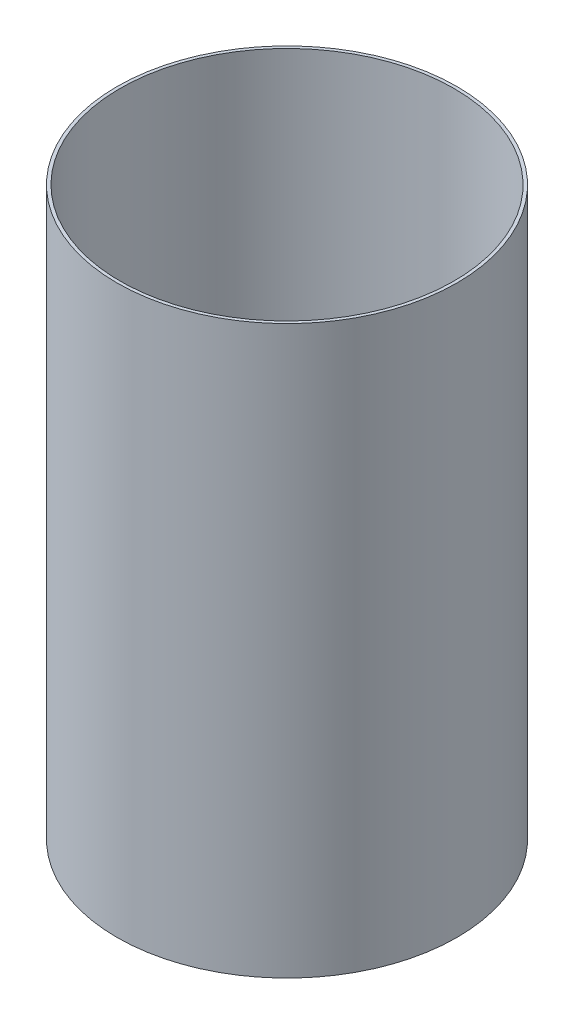
ISO-10303-21;
HEADER;
FILE_DESCRIPTION(('STEP AP214'),'2;1');
FILE_NAME('part.step','',(''),(''),'','','');
FILE_SCHEMA(('AUTOMOTIVE_DESIGN { 1 0 10303 214 1 1 1 1 }'));
ENDSEC;
DATA;
#1=APPLICATION_CONTEXT('core data for automotive mechanical design processes');
#2=APPLICATION_PROTOCOL_DEFINITION('international standard','automotive_design',2000,#1);
#3=PRODUCT_CONTEXT('',#1,'mechanical');
#4=PRODUCT('Part','Part','',(#3));
#5=PRODUCT_RELATED_PRODUCT_CATEGORY('part','',(#4));
#6=PRODUCT_DEFINITION_FORMATION('','',#4);
#7=PRODUCT_DEFINITION_CONTEXT('part definition',#1,'design');
#8=PRODUCT_DEFINITION('design','',#6,#7);
#9=PRODUCT_DEFINITION_SHAPE('','',#8);
#10=(LENGTH_UNIT() NAMED_UNIT(*) SI_UNIT(.MILLI.,.METRE.));
#11=(NAMED_UNIT(*) PLANE_ANGLE_UNIT() SI_UNIT($,.RADIAN.));
#12=(NAMED_UNIT(*) SI_UNIT($,.STERADIAN.) SOLID_ANGLE_UNIT());
#13=UNCERTAINTY_MEASURE_WITH_UNIT(LENGTH_MEASURE(1.E-05),#10,'distance_accuracy_value','');
#14=(GEOMETRIC_REPRESENTATION_CONTEXT(3) GLOBAL_UNCERTAINTY_ASSIGNED_CONTEXT((#13)) GLOBAL_UNIT_ASSIGNED_CONTEXT((#10,
#11,#12)) REPRESENTATION_CONTEXT('',''));
#15=CARTESIAN_POINT('',(0.,0.,0.));
#16=DIRECTION('',(0.,0.,1.));
#17=DIRECTION('',(1.,0.,0.));
#18=AXIS2_PLACEMENT_3D('',#15,#16,#17);
#19=CARTESIAN_POINT('',(0.,-59.999999882,0.));
#20=DIRECTION('',(0.,-1.,0.));
#21=DIRECTION('',(0.,0.,-1.));
#22=AXIS2_PLACEMENT_3D('',#19,#20,#21);
#23=CYLINDRICAL_SURFACE('',#22,67.7341988827448);
#24=CARTESIAN_POINT('',(0.,-59.999999882,0.));
#25=DIRECTION('',(0.,-1.,0.));
#26=DIRECTION('',(0.,0.,-1.));
#27=AXIS2_PLACEMENT_3D('',#24,#25,#26);
#28=CIRCLE('',#27,67.7341988827448);
#29=CARTESIAN_POINT('',(0.,-59.999999882,-67.7341988827448));
#30=VERTEX_POINT('',#29);
#31=EDGE_CURVE('E46',#30,#30,#28,.T.);
#32=ORIENTED_EDGE('',*,*,#31,.F.);
#33=EDGE_LOOP('',(#32));
#34=FACE_BOUND('',#33,.T.);
#35=CARTESIAN_POINT('',(0.,-289.999999882,0.));
#36=DIRECTION('',(0.,-1.,0.));
#37=DIRECTION('',(0.,0.,-1.));
#38=AXIS2_PLACEMENT_3D('',#35,#36,#37);
#39=CIRCLE('',#38,67.7341988827448);
#40=CARTESIAN_POINT('',(0.,-289.999999882,-67.7341988827448));
#41=VERTEX_POINT('',#40);
#42=EDGE_CURVE('E52',#41,#41,#39,.T.);
#43=ORIENTED_EDGE('',*,*,#42,.T.);
#44=EDGE_LOOP('',(#43));
#45=FACE_BOUND('',#44,.T.);
#46=ADVANCED_FACE('F39',(#34,#45),#23,.F.);
#47=CARTESIAN_POINT('',(0.,-59.999999882,0.));
#48=DIRECTION('',(0.,-1.,0.));
#49=DIRECTION('',(0.,0.,-1.));
#50=AXIS2_PLACEMENT_3D('',#47,#48,#49);
#51=CYLINDRICAL_SURFACE('',#50,69.0041988827448);
#52=CARTESIAN_POINT('',(0.,-59.999999882,0.));
#53=DIRECTION('',(0.,-1.,0.));
#54=DIRECTION('',(0.,0.,-1.));
#55=AXIS2_PLACEMENT_3D('',#52,#53,#54);
#56=CIRCLE('',#55,69.0041988827448);
#57=CARTESIAN_POINT('',(0.,-59.999999882,-69.0041988827448));
#58=VERTEX_POINT('',#57);
#59=EDGE_CURVE('E10',#58,#58,#56,.T.);
#60=ORIENTED_EDGE('',*,*,#59,.T.);
#61=EDGE_LOOP('',(#60));
#62=FACE_BOUND('',#61,.T.);
#63=CARTESIAN_POINT('',(0.,-289.999999882,0.));
#64=DIRECTION('',(0.,-1.,0.));
#65=DIRECTION('',(0.,0.,-1.));
#66=AXIS2_PLACEMENT_3D('',#63,#64,#65);
#67=CIRCLE('',#66,69.0041988827448);
#68=CARTESIAN_POINT('',(0.,-289.999999882,-69.0041988827448));
#69=VERTEX_POINT('',#68);
#70=EDGE_CURVE('E42',#69,#69,#67,.T.);
#71=ORIENTED_EDGE('',*,*,#70,.F.);
#72=EDGE_LOOP('',(#71));
#73=FACE_BOUND('',#72,.T.);
#74=ADVANCED_FACE('F61',(#62,#73),#51,.T.);
#75=CARTESIAN_POINT('',(0.,-59.999999882,0.));
#76=DIRECTION('',(0.,-1.,0.));
#77=DIRECTION('',(0.,0.,-1.));
#78=AXIS2_PLACEMENT_3D('',#75,#76,#77);
#79=PLANE('',#78);
#80=ORIENTED_EDGE('',*,*,#31,.T.);
#81=EDGE_LOOP('',(#80));
#82=FACE_BOUND('',#81,.T.);
#83=ORIENTED_EDGE('',*,*,#59,.F.);
#84=EDGE_LOOP('',(#83));
#85=FACE_BOUND('',#84,.T.);
#86=ADVANCED_FACE('F63',(#82,#85),#79,.F.);
#87=CARTESIAN_POINT('',(0.,-289.999999882,0.));
#88=DIRECTION('',(0.,-1.,0.));
#89=DIRECTION('',(0.,0.,-1.));
#90=AXIS2_PLACEMENT_3D('',#87,#88,#89);
#91=PLANE('',#90);
#92=ORIENTED_EDGE('',*,*,#42,.F.);
#93=EDGE_LOOP('',(#92));
#94=FACE_BOUND('',#93,.T.);
#95=ORIENTED_EDGE('',*,*,#70,.T.);
#96=EDGE_LOOP('',(#95));
#97=FACE_BOUND('',#96,.T.);
#98=ADVANCED_FACE('F59',(#94,#97),#91,.T.);
#99=CLOSED_SHELL('',(#46,#74,#86,#98));
#100=MANIFOLD_SOLID_BREP('B2',#99);
#101=ADVANCED_BREP_SHAPE_REPRESENTATION('',(#18,#100),#14);
#102=SHAPE_DEFINITION_REPRESENTATION(#9,#101);
ENDSEC;
END-ISO-10303-21;
